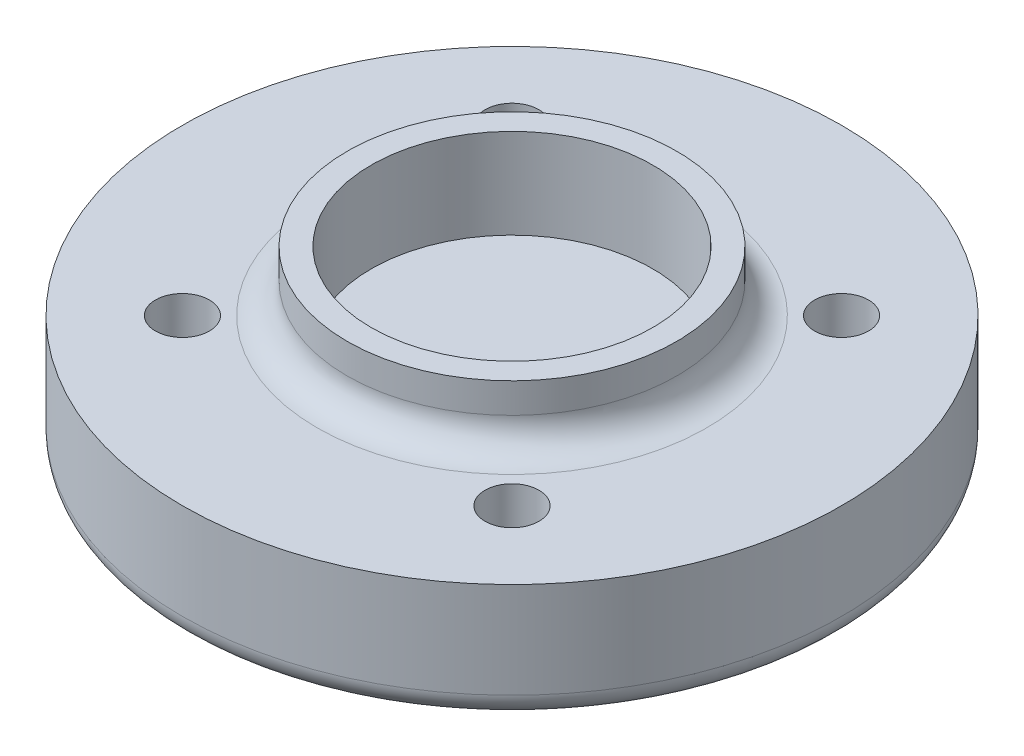
ISO-10303-21;
HEADER;
FILE_DESCRIPTION(('STEP AP214'),'2;1');
FILE_NAME('part.step','',(''),(''),'','','');
FILE_SCHEMA(('AUTOMOTIVE_DESIGN { 1 0 10303 214 1 1 1 1 }'));
ENDSEC;
DATA;
#1=APPLICATION_CONTEXT('core data for automotive mechanical design processes');
#2=APPLICATION_PROTOCOL_DEFINITION('international standard','automotive_design',2000,#1);
#3=PRODUCT_CONTEXT('',#1,'mechanical');
#4=PRODUCT('Part','Part','',(#3));
#5=PRODUCT_RELATED_PRODUCT_CATEGORY('part','',(#4));
#6=PRODUCT_DEFINITION_FORMATION('','',#4);
#7=PRODUCT_DEFINITION_CONTEXT('part definition',#1,'design');
#8=PRODUCT_DEFINITION('design','',#6,#7);
#9=PRODUCT_DEFINITION_SHAPE('','',#8);
#10=(LENGTH_UNIT() NAMED_UNIT(*) SI_UNIT(.MILLI.,.METRE.));
#11=(NAMED_UNIT(*) PLANE_ANGLE_UNIT() SI_UNIT($,.RADIAN.));
#12=(NAMED_UNIT(*) SI_UNIT($,.STERADIAN.) SOLID_ANGLE_UNIT());
#13=UNCERTAINTY_MEASURE_WITH_UNIT(LENGTH_MEASURE(1.E-05),#10,'distance_accuracy_value','');
#14=(GEOMETRIC_REPRESENTATION_CONTEXT(3) GLOBAL_UNCERTAINTY_ASSIGNED_CONTEXT((#13)) GLOBAL_UNIT_ASSIGNED_CONTEXT((#10,
#11,#12)) REPRESENTATION_CONTEXT('',''));
#15=CARTESIAN_POINT('',(0.,0.,0.));
#16=DIRECTION('',(0.,0.,1.));
#17=DIRECTION('',(1.,0.,0.));
#18=AXIS2_PLACEMENT_3D('',#15,#16,#17);
#19=CARTESIAN_POINT('',(0.,20.,0.));
#20=DIRECTION('',(0.,-1.,0.));
#21=DIRECTION('',(0.,0.,-1.));
#22=AXIS2_PLACEMENT_3D('',#19,#20,#21);
#23=CYLINDRICAL_SURFACE('',#22,55.);
#24=CARTESIAN_POINT('',(0.,4.,0.));
#25=DIRECTION('',(0.,1.,0.));
#26=DIRECTION('',(0.,0.,1.));
#27=AXIS2_PLACEMENT_3D('',#24,#25,#26);
#28=CIRCLE('',#27,55.);
#29=CARTESIAN_POINT('',(0.,4.,55.));
#30=VERTEX_POINT('',#29);
#31=EDGE_CURVE('E44',#30,#30,#28,.T.);
#32=ORIENTED_EDGE('',*,*,#31,.T.);
#33=EDGE_LOOP('',(#32));
#34=FACE_BOUND('',#33,.T.);
#35=CARTESIAN_POINT('',(0.,20.,0.));
#36=DIRECTION('',(0.,1.,0.));
#37=DIRECTION('',(0.,0.,1.));
#38=AXIS2_PLACEMENT_3D('',#35,#36,#37);
#39=CIRCLE('',#38,55.);
#40=CARTESIAN_POINT('',(0.,20.,55.));
#41=VERTEX_POINT('',#40);
#42=EDGE_CURVE('E77',#41,#41,#39,.T.);
#43=ORIENTED_EDGE('',*,*,#42,.F.);
#44=EDGE_LOOP('',(#43));
#45=FACE_BOUND('',#44,.T.);
#46=ADVANCED_FACE('F37',(#34,#45),#23,.T.);
#47=CARTESIAN_POINT('',(0.,20.,0.));
#48=DIRECTION('',(0.,1.,0.));
#49=DIRECTION('',(0.,0.,1.));
#50=AXIS2_PLACEMENT_3D('',#47,#48,#49);
#51=PLANE('',#50);
#52=CARTESIAN_POINT('',(27.5,20.,-27.5));
#53=DIRECTION('',(0.,1.,0.));
#54=DIRECTION('',(0.,0.,1.));
#55=AXIS2_PLACEMENT_3D('',#52,#53,#54);
#56=CIRCLE('',#55,4.5);
#57=CARTESIAN_POINT('',(27.5,20.,-23.));
#58=VERTEX_POINT('',#57);
#59=EDGE_CURVE('E55',#58,#58,#56,.T.);
#60=ORIENTED_EDGE('',*,*,#59,.F.);
#61=EDGE_LOOP('',(#60));
#62=FACE_BOUND('',#61,.T.);
#63=CARTESIAN_POINT('',(-27.5,20.,-27.5));
#64=DIRECTION('',(0.,1.,0.));
#65=DIRECTION('',(0.,0.,1.));
#66=AXIS2_PLACEMENT_3D('',#63,#64,#65);
#67=CIRCLE('',#66,4.5);
#68=CARTESIAN_POINT('',(-27.5,20.,-23.));
#69=VERTEX_POINT('',#68);
#70=EDGE_CURVE('E60',#69,#69,#67,.T.);
#71=ORIENTED_EDGE('',*,*,#70,.F.);
#72=EDGE_LOOP('',(#71));
#73=FACE_BOUND('',#72,.T.);
#74=CARTESIAN_POINT('',(-27.5,20.,27.5));
#75=DIRECTION('',(0.,1.,0.));
#76=DIRECTION('',(0.,0.,1.));
#77=AXIS2_PLACEMENT_3D('',#74,#75,#76);
#78=CIRCLE('',#77,4.5);
#79=CARTESIAN_POINT('',(-27.5,20.,32.));
#80=VERTEX_POINT('',#79);
#81=EDGE_CURVE('E65',#80,#80,#78,.T.);
#82=ORIENTED_EDGE('',*,*,#81,.F.);
#83=EDGE_LOOP('',(#82));
#84=FACE_BOUND('',#83,.T.);
#85=CARTESIAN_POINT('',(27.5,20.,27.5));
#86=DIRECTION('',(0.,1.,0.));
#87=DIRECTION('',(0.,0.,1.));
#88=AXIS2_PLACEMENT_3D('',#85,#86,#87);
#89=CIRCLE('',#88,4.5);
#90=CARTESIAN_POINT('',(27.5,20.,32.));
#91=VERTEX_POINT('',#90);
#92=EDGE_CURVE('E70',#91,#91,#89,.T.);
#93=ORIENTED_EDGE('',*,*,#92,.F.);
#94=EDGE_LOOP('',(#93));
#95=FACE_BOUND('',#94,.T.);
#96=CARTESIAN_POINT('',(0.,20.,0.));
#97=DIRECTION('',(0.,1.,0.));
#98=DIRECTION('',(0.,0.,1.));
#99=AXIS2_PLACEMENT_3D('',#96,#97,#98);
#100=CIRCLE('',#99,32.5);
#101=CARTESIAN_POINT('',(0.,20.,32.5));
#102=VERTEX_POINT('',#101);
#103=EDGE_CURVE('E48',#102,#102,#100,.F.);
#104=ORIENTED_EDGE('',*,*,#103,.T.);
#105=EDGE_LOOP('',(#104));
#106=FACE_BOUND('',#105,.T.);
#107=ORIENTED_EDGE('',*,*,#42,.T.);
#108=EDGE_LOOP('',(#107));
#109=FACE_BOUND('',#108,.T.);
#110=ADVANCED_FACE('F124',(#62,#73,#84,#95,#106,#109),#51,.T.);
#111=CARTESIAN_POINT('',(0.,0.,0.));
#112=DIRECTION('',(0.,1.,0.));
#113=DIRECTION('',(0.,0.,1.));
#114=AXIS2_PLACEMENT_3D('',#111,#112,#113);
#115=PLANE('',#114);
#116=CARTESIAN_POINT('',(0.,0.,0.));
#117=DIRECTION('',(0.,1.,0.));
#118=DIRECTION('',(0.,0.,1.));
#119=AXIS2_PLACEMENT_3D('',#116,#117,#118);
#120=CIRCLE('',#119,51.);
#121=CARTESIAN_POINT('',(0.,0.,51.));
#122=VERTEX_POINT('',#121);
#123=EDGE_CURVE('E10',#122,#122,#120,.F.);
#124=ORIENTED_EDGE('',*,*,#123,.T.);
#125=EDGE_LOOP('',(#124));
#126=FACE_BOUND('',#125,.T.);
#127=CARTESIAN_POINT('',(27.5,0.,-27.5));
#128=DIRECTION('',(0.,-1.,0.));
#129=DIRECTION('',(0.,0.,-1.));
#130=AXIS2_PLACEMENT_3D('',#127,#128,#129);
#131=CIRCLE('',#130,9.0055);
#132=CARTESIAN_POINT('',(27.5,0.,-36.5055));
#133=VERTEX_POINT('',#132);
#134=EDGE_CURVE('E114',#133,#133,#131,.T.);
#135=ORIENTED_EDGE('',*,*,#134,.F.);
#136=EDGE_LOOP('',(#135));
#137=FACE_BOUND('',#136,.T.);
#138=CARTESIAN_POINT('',(-27.5,0.,-27.5));
#139=DIRECTION('',(0.,-1.,0.));
#140=DIRECTION('',(0.,0.,-1.));
#141=AXIS2_PLACEMENT_3D('',#138,#139,#140);
#142=CIRCLE('',#141,9.0055);
#143=CARTESIAN_POINT('',(-27.5,0.,-36.5055));
#144=VERTEX_POINT('',#143);
#145=EDGE_CURVE('E58',#144,#144,#142,.T.);
#146=ORIENTED_EDGE('',*,*,#145,.F.);
#147=EDGE_LOOP('',(#146));
#148=FACE_BOUND('',#147,.T.);
#149=CARTESIAN_POINT('',(-27.5,0.,27.5));
#150=DIRECTION('',(0.,-1.,0.));
#151=DIRECTION('',(0.,0.,-1.));
#152=AXIS2_PLACEMENT_3D('',#149,#150,#151);
#153=CIRCLE('',#152,9.0055);
#154=CARTESIAN_POINT('',(-27.5,0.,18.4945));
#155=VERTEX_POINT('',#154);
#156=EDGE_CURVE('E63',#155,#155,#153,.T.);
#157=ORIENTED_EDGE('',*,*,#156,.F.);
#158=EDGE_LOOP('',(#157));
#159=FACE_BOUND('',#158,.T.);
#160=CARTESIAN_POINT('',(27.5,0.,27.5));
#161=DIRECTION('',(0.,-1.,0.));
#162=DIRECTION('',(0.,0.,-1.));
#163=AXIS2_PLACEMENT_3D('',#160,#161,#162);
#164=CIRCLE('',#163,9.0055);
#165=CARTESIAN_POINT('',(27.5,0.,18.4945));
#166=VERTEX_POINT('',#165);
#167=EDGE_CURVE('E68',#166,#166,#164,.T.);
#168=ORIENTED_EDGE('',*,*,#167,.F.);
#169=EDGE_LOOP('',(#168));
#170=FACE_BOUND('',#169,.T.);
#171=ADVANCED_FACE('F120',(#126,#137,#148,#159,#170),#115,.F.);
#172=CARTESIAN_POINT('',(0.,30.,0.));
#173=DIRECTION('',(0.,-1.,0.));
#174=DIRECTION('',(0.,0.,-1.));
#175=AXIS2_PLACEMENT_3D('',#172,#173,#174);
#176=CYLINDRICAL_SURFACE('',#175,27.5);
#177=CARTESIAN_POINT('',(0.,25.,0.));
#178=DIRECTION('',(0.,1.,0.));
#179=DIRECTION('',(0.,0.,1.));
#180=AXIS2_PLACEMENT_3D('',#177,#178,#179);
#181=CIRCLE('',#180,27.5);
#182=CARTESIAN_POINT('',(0.,25.,27.5));
#183=VERTEX_POINT('',#182);
#184=EDGE_CURVE('E52',#183,#183,#181,.T.);
#185=ORIENTED_EDGE('',*,*,#184,.T.);
#186=EDGE_LOOP('',(#185));
#187=FACE_BOUND('',#186,.T.);
#188=CARTESIAN_POINT('',(0.,30.,0.));
#189=DIRECTION('',(0.,1.,0.));
#190=DIRECTION('',(0.,0.,1.));
#191=AXIS2_PLACEMENT_3D('',#188,#189,#190);
#192=CIRCLE('',#191,27.5);
#193=CARTESIAN_POINT('',(0.,30.,27.5));
#194=VERTEX_POINT('',#193);
#195=EDGE_CURVE('E80',#194,#194,#192,.T.);
#196=ORIENTED_EDGE('',*,*,#195,.F.);
#197=EDGE_LOOP('',(#196));
#198=FACE_BOUND('',#197,.T.);
#199=ADVANCED_FACE('F123',(#187,#198),#176,.T.);
#200=CARTESIAN_POINT('',(0.,30.,0.));
#201=DIRECTION('',(0.,1.,0.));
#202=DIRECTION('',(0.,0.,1.));
#203=AXIS2_PLACEMENT_3D('',#200,#201,#202);
#204=PLANE('',#203);
#205=CARTESIAN_POINT('',(0.,30.,0.));
#206=DIRECTION('',(0.,1.,0.));
#207=DIRECTION('',(0.,0.,1.));
#208=AXIS2_PLACEMENT_3D('',#205,#206,#207);
#209=CIRCLE('',#208,23.5);
#210=CARTESIAN_POINT('',(0.,30.,23.5));
#211=VERTEX_POINT('',#210);
#212=EDGE_CURVE('E72',#211,#211,#209,.T.);
#213=ORIENTED_EDGE('',*,*,#212,.F.);
#214=EDGE_LOOP('',(#213));
#215=FACE_BOUND('',#214,.T.);
#216=ORIENTED_EDGE('',*,*,#195,.T.);
#217=EDGE_LOOP('',(#216));
#218=FACE_BOUND('',#217,.T.);
#219=ADVANCED_FACE('F176',(#215,#218),#204,.T.);
#220=CARTESIAN_POINT('',(0.,15.,0.));
#221=DIRECTION('',(0.,1.,0.));
#222=DIRECTION('',(0.,0.,1.));
#223=AXIS2_PLACEMENT_3D('',#220,#221,#222);
#224=CYLINDRICAL_SURFACE('',#223,23.5);
#225=CARTESIAN_POINT('',(0.,15.,0.));
#226=DIRECTION('',(0.,1.,0.));
#227=DIRECTION('',(0.,0.,1.));
#228=AXIS2_PLACEMENT_3D('',#225,#226,#227);
#229=CIRCLE('',#228,23.5);
#230=CARTESIAN_POINT('',(0.,15.,23.5));
#231=VERTEX_POINT('',#230);
#232=EDGE_CURVE('E83',#231,#231,#229,.T.);
#233=ORIENTED_EDGE('',*,*,#232,.F.);
#234=EDGE_LOOP('',(#233));
#235=FACE_BOUND('',#234,.T.);
#236=ORIENTED_EDGE('',*,*,#212,.T.);
#237=EDGE_LOOP('',(#236));
#238=FACE_BOUND('',#237,.T.);
#239=ADVANCED_FACE('F167',(#235,#238),#224,.F.);
#240=CARTESIAN_POINT('',(0.,15.,0.));
#241=DIRECTION('',(0.,1.,0.));
#242=DIRECTION('',(0.,0.,1.));
#243=AXIS2_PLACEMENT_3D('',#240,#241,#242);
#244=PLANE('',#243);
#245=ORIENTED_EDGE('',*,*,#232,.T.);
#246=EDGE_LOOP('',(#245));
#247=FACE_BOUND('',#246,.T.);
#248=ADVANCED_FACE('F159',(#247),#244,.T.);
#249=CARTESIAN_POINT('',(0.,25.,0.));
#250=DIRECTION('',(0.,1.,0.));
#251=DIRECTION('',(0.,0.,1.));
#252=AXIS2_PLACEMENT_3D('',#249,#250,#251);
#253=TOROIDAL_SURFACE('',#252,32.5,5.);
#254=ORIENTED_EDGE('',*,*,#103,.F.);
#255=EDGE_LOOP('',(#254));
#256=FACE_BOUND('',#255,.T.);
#257=ORIENTED_EDGE('',*,*,#184,.F.);
#258=EDGE_LOOP('',(#257));
#259=FACE_BOUND('',#258,.T.);
#260=ADVANCED_FACE('F157',(#256,#259),#253,.F.);
#261=CARTESIAN_POINT('',(27.5,0.,27.5));
#262=DIRECTION('',(0.,-1.,0.));
#263=DIRECTION('',(0.,0.,-1.));
#264=AXIS2_PLACEMENT_3D('',#261,#262,#263);
#265=CYLINDRICAL_SURFACE('',#264,4.5);
#266=ORIENTED_EDGE('',*,*,#92,.T.);
#267=EDGE_LOOP('',(#266));
#268=FACE_BOUND('',#267,.T.);
#269=CARTESIAN_POINT('',(27.5,5.3,27.5));
#270=DIRECTION('',(0.,-1.,0.));
#271=DIRECTION('',(0.,0.,-1.));
#272=AXIS2_PLACEMENT_3D('',#269,#270,#271);
#273=CIRCLE('',#272,4.5);
#274=CARTESIAN_POINT('',(27.5,5.3,23.));
#275=VERTEX_POINT('',#274);
#276=EDGE_CURVE('E73',#275,#275,#273,.T.);
#277=ORIENTED_EDGE('',*,*,#276,.T.);
#278=EDGE_LOOP('',(#277));
#279=FACE_BOUND('',#278,.T.);
#280=ADVANCED_FACE('F145',(#268,#279),#265,.F.);
#281=CARTESIAN_POINT('',(32.,5.3,27.5));
#282=DIRECTION('',(0.,1.,0.));
#283=DIRECTION('',(0.,0.,1.));
#284=AXIS2_PLACEMENT_3D('',#281,#282,#283);
#285=PLANE('',#284);
#286=ORIENTED_EDGE('',*,*,#276,.F.);
#287=EDGE_LOOP('',(#286));
#288=FACE_BOUND('',#287,.T.);
#289=CARTESIAN_POINT('',(27.5,5.3,27.5));
#290=DIRECTION('',(0.,-1.,0.));
#291=DIRECTION('',(0.,0.,-1.));
#292=AXIS2_PLACEMENT_3D('',#289,#290,#291);
#293=CIRCLE('',#292,9.0055);
#294=CARTESIAN_POINT('',(27.5,5.3,18.4945));
#295=VERTEX_POINT('',#294);
#296=EDGE_CURVE('E90',#295,#295,#293,.T.);
#297=ORIENTED_EDGE('',*,*,#296,.T.);
#298=EDGE_LOOP('',(#297));
#299=FACE_BOUND('',#298,.T.);
#300=ADVANCED_FACE('F135',(#288,#299),#285,.F.);
#301=CARTESIAN_POINT('',(27.5,0.,27.5));
#302=DIRECTION('',(0.,-1.,0.));
#303=DIRECTION('',(0.,0.,-1.));
#304=AXIS2_PLACEMENT_3D('',#301,#302,#303);
#305=CYLINDRICAL_SURFACE('',#304,9.0055);
#306=ORIENTED_EDGE('',*,*,#296,.F.);
#307=EDGE_LOOP('',(#306));
#308=FACE_BOUND('',#307,.T.);
#309=ORIENTED_EDGE('',*,*,#167,.T.);
#310=EDGE_LOOP('',(#309));
#311=FACE_BOUND('',#310,.T.);
#312=ADVANCED_FACE('F132',(#308,#311),#305,.F.);
#313=CARTESIAN_POINT('',(-27.5,0.,27.5));
#314=DIRECTION('',(0.,-1.,0.));
#315=DIRECTION('',(0.,0.,-1.));
#316=AXIS2_PLACEMENT_3D('',#313,#314,#315);
#317=CYLINDRICAL_SURFACE('',#316,4.5);
#318=ORIENTED_EDGE('',*,*,#81,.T.);
#319=EDGE_LOOP('',(#318));
#320=FACE_BOUND('',#319,.T.);
#321=CARTESIAN_POINT('',(-27.5,5.3,27.5));
#322=DIRECTION('',(0.,-1.,0.));
#323=DIRECTION('',(0.,0.,-1.));
#324=AXIS2_PLACEMENT_3D('',#321,#322,#323);
#325=CIRCLE('',#324,4.5);
#326=CARTESIAN_POINT('',(-27.5,5.3,23.));
#327=VERTEX_POINT('',#326);
#328=EDGE_CURVE('E69',#327,#327,#325,.T.);
#329=ORIENTED_EDGE('',*,*,#328,.T.);
#330=EDGE_LOOP('',(#329));
#331=FACE_BOUND('',#330,.T.);
#332=ADVANCED_FACE('F134',(#320,#331),#317,.F.);
#333=CARTESIAN_POINT('',(-23.,5.3,27.5));
#334=DIRECTION('',(0.,1.,0.));
#335=DIRECTION('',(0.,0.,1.));
#336=AXIS2_PLACEMENT_3D('',#333,#334,#335);
#337=PLANE('',#336);
#338=ORIENTED_EDGE('',*,*,#328,.F.);
#339=EDGE_LOOP('',(#338));
#340=FACE_BOUND('',#339,.T.);
#341=CARTESIAN_POINT('',(-27.5,5.3,27.5));
#342=DIRECTION('',(0.,-1.,0.));
#343=DIRECTION('',(0.,0.,-1.));
#344=AXIS2_PLACEMENT_3D('',#341,#342,#343);
#345=CIRCLE('',#344,9.0055);
#346=CARTESIAN_POINT('',(-27.5,5.3,18.4945));
#347=VERTEX_POINT('',#346);
#348=EDGE_CURVE('E97',#347,#347,#345,.T.);
#349=ORIENTED_EDGE('',*,*,#348,.T.);
#350=EDGE_LOOP('',(#349));
#351=FACE_BOUND('',#350,.T.);
#352=ADVANCED_FACE('F142',(#340,#351),#337,.F.);
#353=CARTESIAN_POINT('',(-27.5,0.,27.5));
#354=DIRECTION('',(0.,-1.,0.));
#355=DIRECTION('',(0.,0.,-1.));
#356=AXIS2_PLACEMENT_3D('',#353,#354,#355);
#357=CYLINDRICAL_SURFACE('',#356,9.0055);
#358=ORIENTED_EDGE('',*,*,#348,.F.);
#359=EDGE_LOOP('',(#358));
#360=FACE_BOUND('',#359,.T.);
#361=ORIENTED_EDGE('',*,*,#156,.T.);
#362=EDGE_LOOP('',(#361));
#363=FACE_BOUND('',#362,.T.);
#364=ADVANCED_FACE('F247',(#360,#363),#357,.F.);
#365=CARTESIAN_POINT('',(-27.5,0.,-27.5));
#366=DIRECTION('',(0.,-1.,0.));
#367=DIRECTION('',(0.,0.,-1.));
#368=AXIS2_PLACEMENT_3D('',#365,#366,#367);
#369=CYLINDRICAL_SURFACE('',#368,4.5);
#370=ORIENTED_EDGE('',*,*,#70,.T.);
#371=EDGE_LOOP('',(#370));
#372=FACE_BOUND('',#371,.T.);
#373=CARTESIAN_POINT('',(-27.5,5.3,-27.5));
#374=DIRECTION('',(0.,-1.,0.));
#375=DIRECTION('',(0.,0.,-1.));
#376=AXIS2_PLACEMENT_3D('',#373,#374,#375);
#377=CIRCLE('',#376,4.5);
#378=CARTESIAN_POINT('',(-27.5,5.3,-32.));
#379=VERTEX_POINT('',#378);
#380=EDGE_CURVE('E64',#379,#379,#377,.T.);
#381=ORIENTED_EDGE('',*,*,#380,.T.);
#382=EDGE_LOOP('',(#381));
#383=FACE_BOUND('',#382,.T.);
#384=ADVANCED_FACE('F257',(#372,#383),#369,.F.);
#385=CARTESIAN_POINT('',(-23.,5.3,-27.5));
#386=DIRECTION('',(0.,1.,0.));
#387=DIRECTION('',(0.,0.,1.));
#388=AXIS2_PLACEMENT_3D('',#385,#386,#387);
#389=PLANE('',#388);
#390=ORIENTED_EDGE('',*,*,#380,.F.);
#391=EDGE_LOOP('',(#390));
#392=FACE_BOUND('',#391,.T.);
#393=CARTESIAN_POINT('',(-27.5,5.3,-27.5));
#394=DIRECTION('',(0.,-1.,0.));
#395=DIRECTION('',(0.,0.,-1.));
#396=AXIS2_PLACEMENT_3D('',#393,#394,#395);
#397=CIRCLE('',#396,9.0055);
#398=CARTESIAN_POINT('',(-27.5,5.3,-36.5055));
#399=VERTEX_POINT('',#398);
#400=EDGE_CURVE('E104',#399,#399,#397,.T.);
#401=ORIENTED_EDGE('',*,*,#400,.T.);
#402=EDGE_LOOP('',(#401));
#403=FACE_BOUND('',#402,.T.);
#404=ADVANCED_FACE('F267',(#392,#403),#389,.F.);
#405=CARTESIAN_POINT('',(-27.5,0.,-27.5));
#406=DIRECTION('',(0.,-1.,0.));
#407=DIRECTION('',(0.,0.,-1.));
#408=AXIS2_PLACEMENT_3D('',#405,#406,#407);
#409=CYLINDRICAL_SURFACE('',#408,9.0055);
#410=ORIENTED_EDGE('',*,*,#400,.F.);
#411=EDGE_LOOP('',(#410));
#412=FACE_BOUND('',#411,.T.);
#413=ORIENTED_EDGE('',*,*,#145,.T.);
#414=EDGE_LOOP('',(#413));
#415=FACE_BOUND('',#414,.T.);
#416=ADVANCED_FACE('F277',(#412,#415),#409,.F.);
#417=CARTESIAN_POINT('',(27.5,0.,-27.5));
#418=DIRECTION('',(0.,-1.,0.));
#419=DIRECTION('',(0.,0.,-1.));
#420=AXIS2_PLACEMENT_3D('',#417,#418,#419);
#421=CYLINDRICAL_SURFACE('',#420,4.5);
#422=ORIENTED_EDGE('',*,*,#59,.T.);
#423=EDGE_LOOP('',(#422));
#424=FACE_BOUND('',#423,.T.);
#425=CARTESIAN_POINT('',(27.5,5.3,-27.5));
#426=DIRECTION('',(0.,-1.,0.));
#427=DIRECTION('',(0.,0.,-1.));
#428=AXIS2_PLACEMENT_3D('',#425,#426,#427);
#429=CIRCLE('',#428,4.5);
#430=CARTESIAN_POINT('',(27.5,5.3,-32.));
#431=VERTEX_POINT('',#430);
#432=EDGE_CURVE('E59',#431,#431,#429,.T.);
#433=ORIENTED_EDGE('',*,*,#432,.T.);
#434=EDGE_LOOP('',(#433));
#435=FACE_BOUND('',#434,.T.);
#436=ADVANCED_FACE('F287',(#424,#435),#421,.F.);
#437=CARTESIAN_POINT('',(32.,5.3,-27.5));
#438=DIRECTION('',(0.,1.,0.));
#439=DIRECTION('',(0.,0.,1.));
#440=AXIS2_PLACEMENT_3D('',#437,#438,#439);
#441=PLANE('',#440);
#442=ORIENTED_EDGE('',*,*,#432,.F.);
#443=EDGE_LOOP('',(#442));
#444=FACE_BOUND('',#443,.T.);
#445=CARTESIAN_POINT('',(27.5,5.3,-27.5));
#446=DIRECTION('',(0.,-1.,0.));
#447=DIRECTION('',(0.,0.,-1.));
#448=AXIS2_PLACEMENT_3D('',#445,#446,#447);
#449=CIRCLE('',#448,9.0055);
#450=CARTESIAN_POINT('',(27.5,5.3,-36.5055));
#451=VERTEX_POINT('',#450);
#452=EDGE_CURVE('E111',#451,#451,#449,.T.);
#453=ORIENTED_EDGE('',*,*,#452,.T.);
#454=EDGE_LOOP('',(#453));
#455=FACE_BOUND('',#454,.T.);
#456=ADVANCED_FACE('F297',(#444,#455),#441,.F.);
#457=CARTESIAN_POINT('',(27.5,0.,-27.5));
#458=DIRECTION('',(0.,-1.,0.));
#459=DIRECTION('',(0.,0.,-1.));
#460=AXIS2_PLACEMENT_3D('',#457,#458,#459);
#461=CYLINDRICAL_SURFACE('',#460,9.0055);
#462=ORIENTED_EDGE('',*,*,#452,.F.);
#463=EDGE_LOOP('',(#462));
#464=FACE_BOUND('',#463,.T.);
#465=ORIENTED_EDGE('',*,*,#134,.T.);
#466=EDGE_LOOP('',(#465));
#467=FACE_BOUND('',#466,.T.);
#468=ADVANCED_FACE('F118',(#464,#467),#461,.F.);
#469=CARTESIAN_POINT('',(0.,4.,0.));
#470=DIRECTION('',(0.,1.,0.));
#471=DIRECTION('',(0.,0.,1.));
#472=AXIS2_PLACEMENT_3D('',#469,#470,#471);
#473=TOROIDAL_SURFACE('',#472,51.,4.);
#474=ORIENTED_EDGE('',*,*,#123,.F.);
#475=EDGE_LOOP('',(#474));
#476=FACE_BOUND('',#475,.T.);
#477=ORIENTED_EDGE('',*,*,#31,.F.);
#478=EDGE_LOOP('',(#477));
#479=FACE_BOUND('',#478,.T.);
#480=ADVANCED_FACE('F39',(#476,#479),#473,.T.);
#481=CLOSED_SHELL('',(#46,#110,#171,#199,#219,#239,#248,#260,#280,#300,#312,#332,#352,#364,#384,
#404,#416,#436,#456,#468,#480));
#482=MANIFOLD_SOLID_BREP('B2',#481);
#483=ADVANCED_BREP_SHAPE_REPRESENTATION('',(#18,#482),#14);
#484=SHAPE_DEFINITION_REPRESENTATION(#9,#483);
ENDSEC;
END-ISO-10303-21;
